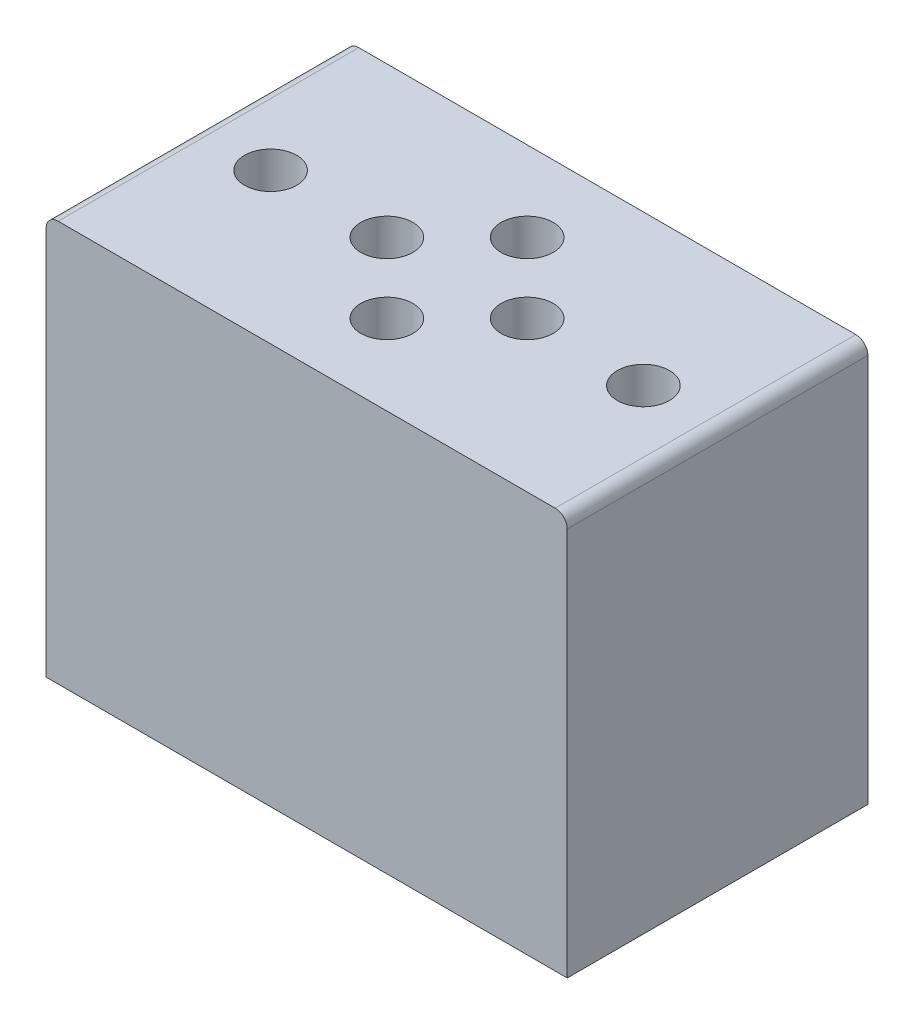
ISO-10303-21;
HEADER;
FILE_DESCRIPTION(('STEP AP214'),'2;1');
FILE_NAME('part.step','',(''),(''),'','','');
FILE_SCHEMA(('AUTOMOTIVE_DESIGN { 1 0 10303 214 1 1 1 1 }'));
ENDSEC;
DATA;
#1=APPLICATION_CONTEXT('core data for automotive mechanical design processes');
#2=APPLICATION_PROTOCOL_DEFINITION('international standard','automotive_design',2000,#1);
#3=PRODUCT_CONTEXT('',#1,'mechanical');
#4=PRODUCT('Part','Part','',(#3));
#5=PRODUCT_RELATED_PRODUCT_CATEGORY('part','',(#4));
#6=PRODUCT_DEFINITION_FORMATION('','',#4);
#7=PRODUCT_DEFINITION_CONTEXT('part definition',#1,'design');
#8=PRODUCT_DEFINITION('design','',#6,#7);
#9=PRODUCT_DEFINITION_SHAPE('','',#8);
#10=(LENGTH_UNIT() NAMED_UNIT(*) SI_UNIT(.MILLI.,.METRE.));
#11=(NAMED_UNIT(*) PLANE_ANGLE_UNIT() SI_UNIT($,.RADIAN.));
#12=(NAMED_UNIT(*) SI_UNIT($,.STERADIAN.) SOLID_ANGLE_UNIT());
#13=UNCERTAINTY_MEASURE_WITH_UNIT(LENGTH_MEASURE(1.E-05),#10,'distance_accuracy_value','');
#14=(GEOMETRIC_REPRESENTATION_CONTEXT(3) GLOBAL_UNCERTAINTY_ASSIGNED_CONTEXT((#13)) GLOBAL_UNIT_ASSIGNED_CONTEXT((#10,
#11,#12)) REPRESENTATION_CONTEXT('',''));
#15=CARTESIAN_POINT('',(0.,0.,0.));
#16=DIRECTION('',(0.,0.,1.));
#17=DIRECTION('',(1.,0.,0.));
#18=AXIS2_PLACEMENT_3D('',#15,#16,#17);
#19=CARTESIAN_POINT('',(17.3031363202317,13.4467980170822,-20.));
#20=DIRECTION('',(1.,0.,0.));
#21=DIRECTION('',(0.,1.,0.));
#22=AXIS2_PLACEMENT_3D('',#19,#20,#21);
#23=PLANE('',#22);
#24=DIRECTION('',(0.,0.,1.));
#25=VECTOR('',#24,1.);
#26=CARTESIAN_POINT('',(17.3031363202317,13.4467980170822,-20.));
#27=LINE('',#26,#25);
#28=CARTESIAN_POINT('',(17.3031363202317,13.4467980170822,-20.));
#29=VERTEX_POINT('',#28);
#30=CARTESIAN_POINT('',(17.3031363202317,13.4467980170822,10.));
#31=VERTEX_POINT('',#30);
#32=EDGE_CURVE('E38',#29,#31,#27,.T.);
#33=ORIENTED_EDGE('',*,*,#32,.T.);
#34=DIRECTION('',(0.,1.,0.));
#35=VECTOR('',#34,1.);
#36=CARTESIAN_POINT('',(17.3031363202317,-25.3532019829178,10.));
#37=LINE('',#36,#35);
#38=CARTESIAN_POINT('',(17.3031363202317,-25.3532019829178,10.));
#39=VERTEX_POINT('',#38);
#40=EDGE_CURVE('E91',#39,#31,#37,.T.);
#41=ORIENTED_EDGE('',*,*,#40,.F.);
#42=DIRECTION('',(0.,0.,1.));
#43=VECTOR('',#42,1.);
#44=CARTESIAN_POINT('',(17.3031363202317,-25.3532019829178,-20.));
#45=LINE('',#44,#43);
#46=CARTESIAN_POINT('',(17.3031363202317,-25.3532019829178,-20.));
#47=VERTEX_POINT('',#46);
#48=EDGE_CURVE('E11',#47,#39,#45,.T.);
#49=ORIENTED_EDGE('',*,*,#48,.F.);
#50=DIRECTION('',(0.,1.,0.));
#51=VECTOR('',#50,1.);
#52=CARTESIAN_POINT('',(17.3031363202317,13.4467980170822,-20.));
#53=LINE('',#52,#51);
#54=EDGE_CURVE('E118',#47,#29,#53,.T.);
#55=ORIENTED_EDGE('',*,*,#54,.T.);
#56=EDGE_LOOP('',(#33,#41,#49,#55));
#57=FACE_BOUND('',#56,.T.);
#58=ADVANCED_FACE('F35',(#57),#23,.T.);
#59=CARTESIAN_POINT('',(-34.6968636797682,-25.3532019829178,-20.));
#60=DIRECTION('',(0.,-1.,0.));
#61=DIRECTION('',(0.,0.,-1.));
#62=AXIS2_PLACEMENT_3D('',#59,#60,#61);
#63=PLANE('',#62);
#64=ORIENTED_EDGE('',*,*,#48,.T.);
#65=DIRECTION('',(1.,0.,0.));
#66=VECTOR('',#65,1.);
#67=CARTESIAN_POINT('',(-34.6968636797682,-25.3532019829178,10.));
#68=LINE('',#67,#66);
#69=CARTESIAN_POINT('',(-34.6968636797682,-25.3532019829178,10.));
#70=VERTEX_POINT('',#69);
#71=EDGE_CURVE('E87',#70,#39,#68,.T.);
#72=ORIENTED_EDGE('',*,*,#71,.F.);
#73=DIRECTION('',(0.,0.,1.));
#74=VECTOR('',#73,1.);
#75=CARTESIAN_POINT('',(-34.6968636797682,-25.3532019829178,-20.));
#76=LINE('',#75,#74);
#77=CARTESIAN_POINT('',(-34.6968636797682,-25.3532019829178,-20.));
#78=VERTEX_POINT('',#77);
#79=EDGE_CURVE('E43',#78,#70,#76,.T.);
#80=ORIENTED_EDGE('',*,*,#79,.F.);
#81=DIRECTION('',(1.,0.,0.));
#82=VECTOR('',#81,1.);
#83=CARTESIAN_POINT('',(-34.6968636797682,-25.3532019829178,-20.));
#84=LINE('',#83,#82);
#85=EDGE_CURVE('E89',#78,#47,#84,.T.);
#86=ORIENTED_EDGE('',*,*,#85,.T.);
#87=EDGE_LOOP('',(#64,#72,#80,#86));
#88=FACE_BOUND('',#87,.T.);
#89=ADVANCED_FACE('F85',(#88),#63,.T.);
#90=CARTESIAN_POINT('',(-34.6968636797683,13.4467980170822,-20.));
#91=DIRECTION('',(-1.,0.,0.));
#92=DIRECTION('',(0.,-1.,0.));
#93=AXIS2_PLACEMENT_3D('',#90,#91,#92);
#94=PLANE('',#93);
#95=ORIENTED_EDGE('',*,*,#79,.T.);
#96=DIRECTION('',(0.,-1.,0.));
#97=VECTOR('',#96,1.);
#98=CARTESIAN_POINT('',(-34.6968636797683,13.4467980170822,10.));
#99=LINE('',#98,#97);
#100=CARTESIAN_POINT('',(-34.6968636797683,13.4467980170822,10.));
#101=VERTEX_POINT('',#100);
#102=EDGE_CURVE('E101',#101,#70,#99,.T.);
#103=ORIENTED_EDGE('',*,*,#102,.F.);
#104=DIRECTION('',(0.,0.,1.));
#105=VECTOR('',#104,1.);
#106=CARTESIAN_POINT('',(-34.6968636797683,13.4467980170822,-20.));
#107=LINE('',#106,#105);
#108=CARTESIAN_POINT('',(-34.6968636797683,13.4467980170822,-20.));
#109=VERTEX_POINT('',#108);
#110=EDGE_CURVE('E133',#109,#101,#107,.T.);
#111=ORIENTED_EDGE('',*,*,#110,.F.);
#112=DIRECTION('',(0.,-1.,0.));
#113=VECTOR('',#112,1.);
#114=CARTESIAN_POINT('',(-34.6968636797683,13.4467980170822,-20.));
#115=LINE('',#114,#113);
#116=EDGE_CURVE('E129',#109,#78,#115,.T.);
#117=ORIENTED_EDGE('',*,*,#116,.T.);
#118=EDGE_LOOP('',(#95,#103,#111,#117));
#119=FACE_BOUND('',#118,.T.);
#120=ADVANCED_FACE('F152',(#119),#94,.T.);
#121=CARTESIAN_POINT('',(-33.4968636797683,13.4467980170822,-20.));
#122=DIRECTION('',(0.,0.,1.));
#123=DIRECTION('',(1.,0.,0.));
#124=AXIS2_PLACEMENT_3D('',#121,#122,#123);
#125=CYLINDRICAL_SURFACE('',#124,1.2);
#126=ORIENTED_EDGE('',*,*,#110,.T.);
#127=CARTESIAN_POINT('',(-33.4968636797683,13.4467980170822,10.));
#128=DIRECTION('',(0.,0.,1.));
#129=DIRECTION('',(1.,0.,0.));
#130=AXIS2_PLACEMENT_3D('',#127,#128,#129);
#131=CIRCLE('',#130,1.2);
#132=CARTESIAN_POINT('',(-33.4968636797683,14.6467980170822,10.));
#133=VERTEX_POINT('',#132);
#134=EDGE_CURVE('E115',#133,#101,#131,.T.);
#135=ORIENTED_EDGE('',*,*,#134,.F.);
#136=DIRECTION('',(0.,0.,1.));
#137=VECTOR('',#136,1.);
#138=CARTESIAN_POINT('',(-33.4968636797683,14.6467980170822,-20.));
#139=LINE('',#138,#137);
#140=CARTESIAN_POINT('',(-33.4968636797683,14.6467980170822,-20.));
#141=VERTEX_POINT('',#140);
#142=EDGE_CURVE('E135',#141,#133,#139,.T.);
#143=ORIENTED_EDGE('',*,*,#142,.F.);
#144=CARTESIAN_POINT('',(-33.4968636797683,13.4467980170822,-20.));
#145=DIRECTION('',(0.,0.,1.));
#146=DIRECTION('',(1.,0.,0.));
#147=AXIS2_PLACEMENT_3D('',#144,#145,#146);
#148=CIRCLE('',#147,1.2);
#149=EDGE_CURVE('E126',#141,#109,#148,.T.);
#150=ORIENTED_EDGE('',*,*,#149,.T.);
#151=EDGE_LOOP('',(#126,#135,#143,#150));
#152=FACE_BOUND('',#151,.T.);
#153=ADVANCED_FACE('F147',(#152),#125,.T.);
#154=CARTESIAN_POINT('',(-33.4968636797683,14.6467980170822,-20.));
#155=DIRECTION('',(0.,1.,0.));
#156=DIRECTION('',(0.,0.,1.));
#157=AXIS2_PLACEMENT_3D('',#154,#155,#156);
#158=PLANE('',#157);
#159=CARTESIAN_POINT('',(-27.296863679768,14.6467980170822,-5.));
#160=DIRECTION('',(0.,1.,0.));
#161=DIRECTION('',(0.,0.,1.));
#162=AXIS2_PLACEMENT_3D('',#159,#160,#161);
#163=CIRCLE('',#162,2.6);
#164=CARTESIAN_POINT('',(-27.296863679768,14.6467980170822,-2.4));
#165=VERTEX_POINT('',#164);
#166=EDGE_CURVE('E105',#165,#165,#163,.T.);
#167=ORIENTED_EDGE('',*,*,#166,.F.);
#168=EDGE_LOOP('',(#167));
#169=FACE_BOUND('',#168,.T.);
#170=CARTESIAN_POINT('',(-1.696863679768,14.6467980170822,-5.));
#171=DIRECTION('',(0.,1.,0.));
#172=DIRECTION('',(0.,0.,1.));
#173=AXIS2_PLACEMENT_3D('',#170,#171,#172);
#174=CIRCLE('',#173,2.6);
#175=CARTESIAN_POINT('',(-1.696863679768,14.6467980170822,-2.4));
#176=VERTEX_POINT('',#175);
#177=EDGE_CURVE('E381',#176,#176,#174,.T.);
#178=ORIENTED_EDGE('',*,*,#177,.F.);
#179=EDGE_LOOP('',(#178));
#180=FACE_BOUND('',#179,.T.);
#181=CARTESIAN_POINT('',(-8.696863679768,14.6467980170822,2.));
#182=DIRECTION('',(0.,1.,0.));
#183=DIRECTION('',(0.,0.,1.));
#184=AXIS2_PLACEMENT_3D('',#181,#182,#183);
#185=CIRCLE('',#184,2.6);
#186=CARTESIAN_POINT('',(-8.696863679768,14.6467980170822,4.6));
#187=VERTEX_POINT('',#186);
#188=EDGE_CURVE('E375',#187,#187,#185,.T.);
#189=ORIENTED_EDGE('',*,*,#188,.F.);
#190=EDGE_LOOP('',(#189));
#191=FACE_BOUND('',#190,.T.);
#192=CARTESIAN_POINT('',(-8.696863679768,14.6467980170822,-12.));
#193=DIRECTION('',(0.,1.,0.));
#194=DIRECTION('',(0.,0.,1.));
#195=AXIS2_PLACEMENT_3D('',#192,#193,#194);
#196=CIRCLE('',#195,2.6);
#197=CARTESIAN_POINT('',(-8.696863679768,14.6467980170822,-9.4));
#198=VERTEX_POINT('',#197);
#199=EDGE_CURVE('E374',#198,#198,#196,.T.);
#200=ORIENTED_EDGE('',*,*,#199,.F.);
#201=EDGE_LOOP('',(#200));
#202=FACE_BOUND('',#201,.T.);
#203=CARTESIAN_POINT('',(-15.696863679768,14.6467980170822,-5.));
#204=DIRECTION('',(0.,1.,0.));
#205=DIRECTION('',(0.,0.,1.));
#206=AXIS2_PLACEMENT_3D('',#203,#204,#205);
#207=CIRCLE('',#206,2.6);
#208=CARTESIAN_POINT('',(-15.696863679768,14.6467980170822,-2.4));
#209=VERTEX_POINT('',#208);
#210=EDGE_CURVE('E387',#209,#209,#207,.T.);
#211=ORIENTED_EDGE('',*,*,#210,.F.);
#212=EDGE_LOOP('',(#211));
#213=FACE_BOUND('',#212,.T.);
#214=CARTESIAN_POINT('',(9.903136320232,14.6467980170822,-5.));
#215=DIRECTION('',(0.,1.,0.));
#216=DIRECTION('',(0.,0.,1.));
#217=AXIS2_PLACEMENT_3D('',#214,#215,#216);
#218=CIRCLE('',#217,2.6);
#219=CARTESIAN_POINT('',(9.903136320232,14.6467980170822,-2.4));
#220=VERTEX_POINT('',#219);
#221=EDGE_CURVE('E108',#220,#220,#218,.T.);
#222=ORIENTED_EDGE('',*,*,#221,.F.);
#223=EDGE_LOOP('',(#222));
#224=FACE_BOUND('',#223,.T.);
#225=ORIENTED_EDGE('',*,*,#142,.T.);
#226=DIRECTION('',(-1.,0.,0.));
#227=VECTOR('',#226,1.);
#228=CARTESIAN_POINT('',(16.1031363202317,14.6467980170822,10.));
#229=LINE('',#228,#227);
#230=CARTESIAN_POINT('',(16.1031363202317,14.6467980170822,10.));
#231=VERTEX_POINT('',#230);
#232=EDGE_CURVE('E112',#231,#133,#229,.T.);
#233=ORIENTED_EDGE('',*,*,#232,.F.);
#234=DIRECTION('',(0.,0.,1.));
#235=VECTOR('',#234,1.);
#236=CARTESIAN_POINT('',(16.1031363202317,14.6467980170822,-20.));
#237=LINE('',#236,#235);
#238=CARTESIAN_POINT('',(16.1031363202317,14.6467980170822,-20.));
#239=VERTEX_POINT('',#238);
#240=EDGE_CURVE('E136',#239,#231,#237,.T.);
#241=ORIENTED_EDGE('',*,*,#240,.F.);
#242=DIRECTION('',(-1.,0.,0.));
#243=VECTOR('',#242,1.);
#244=CARTESIAN_POINT('',(-33.4968636797683,14.6467980170822,-20.));
#245=LINE('',#244,#243);
#246=EDGE_CURVE('E123',#239,#141,#245,.T.);
#247=ORIENTED_EDGE('',*,*,#246,.T.);
#248=EDGE_LOOP('',(#225,#233,#241,#247));
#249=FACE_BOUND('',#248,.T.);
#250=ADVANCED_FACE('F144',(#169,#180,#191,#202,#213,#224,#249),#158,.T.);
#251=CARTESIAN_POINT('',(16.1031363202317,13.4467980170822,-20.));
#252=DIRECTION('',(0.,0.,1.));
#253=DIRECTION('',(1.,0.,0.));
#254=AXIS2_PLACEMENT_3D('',#251,#252,#253);
#255=CYLINDRICAL_SURFACE('',#254,1.2);
#256=ORIENTED_EDGE('',*,*,#240,.T.);
#257=CARTESIAN_POINT('',(16.1031363202317,13.4467980170822,10.));
#258=DIRECTION('',(0.,0.,1.));
#259=DIRECTION('',(1.,0.,0.));
#260=AXIS2_PLACEMENT_3D('',#257,#258,#259);
#261=CIRCLE('',#260,1.2);
#262=EDGE_CURVE('E95',#31,#231,#261,.T.);
#263=ORIENTED_EDGE('',*,*,#262,.F.);
#264=ORIENTED_EDGE('',*,*,#32,.F.);
#265=CARTESIAN_POINT('',(16.1031363202317,13.4467980170822,-20.));
#266=DIRECTION('',(0.,0.,1.));
#267=DIRECTION('',(-1.,0.,0.));
#268=AXIS2_PLACEMENT_3D('',#265,#266,#267);
#269=CIRCLE('',#268,1.2);
#270=EDGE_CURVE('E120',#29,#239,#269,.T.);
#271=ORIENTED_EDGE('',*,*,#270,.T.);
#272=EDGE_LOOP('',(#256,#263,#264,#271));
#273=FACE_BOUND('',#272,.T.);
#274=ADVANCED_FACE('F138',(#273),#255,.T.);
#275=CARTESIAN_POINT('',(-33.4968636797683,13.4467980170822,-20.));
#276=DIRECTION('',(0.,0.,1.));
#277=DIRECTION('',(1.,0.,0.));
#278=AXIS2_PLACEMENT_3D('',#275,#276,#277);
#279=PLANE('',#278);
#280=CARTESIAN_POINT('',(-8.69686367976827,-5.3532019829178,-20.));
#281=DIRECTION('',(0.,0.,1.));
#282=DIRECTION('',(1.,0.,0.));
#283=AXIS2_PLACEMENT_3D('',#280,#281,#282);
#284=CIRCLE('',#283,6.6);
#285=CARTESIAN_POINT('',(-2.09686367976826,-5.3532019829178,-20.));
#286=VERTEX_POINT('',#285);
#287=EDGE_CURVE('E363',#286,#286,#284,.F.);
#288=ORIENTED_EDGE('',*,*,#287,.F.);
#289=EDGE_LOOP('',(#288));
#290=FACE_BOUND('',#289,.T.);
#291=ORIENTED_EDGE('',*,*,#54,.F.);
#292=ORIENTED_EDGE('',*,*,#85,.F.);
#293=ORIENTED_EDGE('',*,*,#116,.F.);
#294=ORIENTED_EDGE('',*,*,#149,.F.);
#295=ORIENTED_EDGE('',*,*,#246,.F.);
#296=ORIENTED_EDGE('',*,*,#270,.F.);
#297=EDGE_LOOP('',(#291,#292,#293,#294,#295,#296));
#298=FACE_BOUND('',#297,.T.);
#299=ADVANCED_FACE('F150',(#290,#298),#279,.F.);
#300=CARTESIAN_POINT('',(16.1031363202317,13.4467980170822,10.));
#301=DIRECTION('',(0.,0.,1.));
#302=DIRECTION('',(1.,0.,0.));
#303=AXIS2_PLACEMENT_3D('',#300,#301,#302);
#304=PLANE('',#303);
#305=ORIENTED_EDGE('',*,*,#71,.T.);
#306=ORIENTED_EDGE('',*,*,#40,.T.);
#307=ORIENTED_EDGE('',*,*,#262,.T.);
#308=ORIENTED_EDGE('',*,*,#232,.T.);
#309=ORIENTED_EDGE('',*,*,#134,.T.);
#310=ORIENTED_EDGE('',*,*,#102,.T.);
#311=EDGE_LOOP('',(#305,#306,#307,#308,#309,#310));
#312=FACE_BOUND('',#311,.T.);
#313=ADVANCED_FACE('F98',(#312),#304,.T.);
#314=CARTESIAN_POINT('',(9.903136320232,8.64679801708221,-5.));
#315=DIRECTION('',(0.,1.,0.));
#316=DIRECTION('',(0.,0.,1.));
#317=AXIS2_PLACEMENT_3D('',#314,#315,#316);
#318=CYLINDRICAL_SURFACE('',#317,2.6);
#319=CARTESIAN_POINT('',(9.903136320232,8.64679801708221,-5.));
#320=DIRECTION('',(0.,1.,0.));
#321=DIRECTION('',(0.,0.,1.));
#322=AXIS2_PLACEMENT_3D('',#319,#320,#321);
#323=CIRCLE('',#322,2.6);
#324=CARTESIAN_POINT('',(9.903136320232,8.64679801708221,-2.4));
#325=VERTEX_POINT('',#324);
#326=EDGE_CURVE('E384',#325,#325,#323,.T.);
#327=ORIENTED_EDGE('',*,*,#326,.F.);
#328=EDGE_LOOP('',(#327));
#329=FACE_BOUND('',#328,.T.);
#330=ORIENTED_EDGE('',*,*,#221,.T.);
#331=EDGE_LOOP('',(#330));
#332=FACE_BOUND('',#331,.T.);
#333=ADVANCED_FACE('F201',(#329,#332),#318,.F.);
#334=CARTESIAN_POINT('',(9.903136320232,8.64679801708221,-5.));
#335=DIRECTION('',(0.,1.,0.));
#336=DIRECTION('',(0.,0.,1.));
#337=AXIS2_PLACEMENT_3D('',#334,#335,#336);
#338=PLANE('',#337);
#339=ORIENTED_EDGE('',*,*,#326,.T.);
#340=EDGE_LOOP('',(#339));
#341=FACE_BOUND('',#340,.T.);
#342=ADVANCED_FACE('F218',(#341),#338,.T.);
#343=CARTESIAN_POINT('',(-15.696863679768,8.64679801708221,-5.));
#344=DIRECTION('',(0.,1.,0.));
#345=DIRECTION('',(0.,0.,1.));
#346=AXIS2_PLACEMENT_3D('',#343,#344,#345);
#347=CYLINDRICAL_SURFACE('',#346,2.6);
#348=CARTESIAN_POINT('',(-15.696863679768,8.64679801708221,-5.));
#349=DIRECTION('',(0.,1.,0.));
#350=DIRECTION('',(0.,0.,1.));
#351=AXIS2_PLACEMENT_3D('',#348,#349,#350);
#352=CIRCLE('',#351,2.6);
#353=CARTESIAN_POINT('',(-15.696863679768,8.64679801708221,-2.4));
#354=VERTEX_POINT('',#353);
#355=EDGE_CURVE('E370',#354,#354,#352,.T.);
#356=ORIENTED_EDGE('',*,*,#355,.F.);
#357=EDGE_LOOP('',(#356));
#358=FACE_BOUND('',#357,.T.);
#359=ORIENTED_EDGE('',*,*,#210,.T.);
#360=EDGE_LOOP('',(#359));
#361=FACE_BOUND('',#360,.T.);
#362=ADVANCED_FACE('F228',(#358,#361),#347,.F.);
#363=CARTESIAN_POINT('',(-15.696863679768,8.64679801708221,-5.));
#364=DIRECTION('',(0.,1.,0.));
#365=DIRECTION('',(0.,0.,1.));
#366=AXIS2_PLACEMENT_3D('',#363,#364,#365);
#367=PLANE('',#366);
#368=ORIENTED_EDGE('',*,*,#355,.T.);
#369=EDGE_LOOP('',(#368));
#370=FACE_BOUND('',#369,.T.);
#371=ADVANCED_FACE('F238',(#370),#367,.T.);
#372=CARTESIAN_POINT('',(-8.696863679768,8.64679801708221,-12.));
#373=DIRECTION('',(0.,1.,0.));
#374=DIRECTION('',(0.,0.,1.));
#375=AXIS2_PLACEMENT_3D('',#372,#373,#374);
#376=CYLINDRICAL_SURFACE('',#375,2.6);
#377=CARTESIAN_POINT('',(-8.696863679768,8.64679801708221,-12.));
#378=DIRECTION('',(0.,1.,0.));
#379=DIRECTION('',(0.,0.,1.));
#380=AXIS2_PLACEMENT_3D('',#377,#378,#379);
#381=CIRCLE('',#380,2.6);
#382=CARTESIAN_POINT('',(-8.696863679768,8.64679801708221,-9.4));
#383=VERTEX_POINT('',#382);
#384=EDGE_CURVE('E390',#383,#383,#381,.T.);
#385=ORIENTED_EDGE('',*,*,#384,.F.);
#386=EDGE_LOOP('',(#385));
#387=FACE_BOUND('',#386,.T.);
#388=ORIENTED_EDGE('',*,*,#199,.T.);
#389=EDGE_LOOP('',(#388));
#390=FACE_BOUND('',#389,.T.);
#391=ADVANCED_FACE('F248',(#387,#390),#376,.F.);
#392=CARTESIAN_POINT('',(-8.696863679768,8.64679801708221,-12.));
#393=DIRECTION('',(0.,1.,0.));
#394=DIRECTION('',(0.,0.,1.));
#395=AXIS2_PLACEMENT_3D('',#392,#393,#394);
#396=PLANE('',#395);
#397=ORIENTED_EDGE('',*,*,#384,.T.);
#398=EDGE_LOOP('',(#397));
#399=FACE_BOUND('',#398,.T.);
#400=ADVANCED_FACE('F258',(#399),#396,.T.);
#401=CARTESIAN_POINT('',(-8.696863679768,8.64679801708221,2.));
#402=DIRECTION('',(0.,1.,0.));
#403=DIRECTION('',(0.,0.,1.));
#404=AXIS2_PLACEMENT_3D('',#401,#402,#403);
#405=CYLINDRICAL_SURFACE('',#404,2.6);
#406=CARTESIAN_POINT('',(-8.696863679768,8.64679801708221,2.));
#407=DIRECTION('',(0.,1.,0.));
#408=DIRECTION('',(0.,0.,1.));
#409=AXIS2_PLACEMENT_3D('',#406,#407,#408);
#410=CIRCLE('',#409,2.6);
#411=CARTESIAN_POINT('',(-8.696863679768,8.64679801708221,4.6));
#412=VERTEX_POINT('',#411);
#413=EDGE_CURVE('E371',#412,#412,#410,.T.);
#414=ORIENTED_EDGE('',*,*,#413,.F.);
#415=EDGE_LOOP('',(#414));
#416=FACE_BOUND('',#415,.T.);
#417=ORIENTED_EDGE('',*,*,#188,.T.);
#418=EDGE_LOOP('',(#417));
#419=FACE_BOUND('',#418,.T.);
#420=ADVANCED_FACE('F268',(#416,#419),#405,.F.);
#421=CARTESIAN_POINT('',(-8.696863679768,8.64679801708221,2.));
#422=DIRECTION('',(0.,1.,0.));
#423=DIRECTION('',(0.,0.,1.));
#424=AXIS2_PLACEMENT_3D('',#421,#422,#423);
#425=PLANE('',#424);
#426=ORIENTED_EDGE('',*,*,#413,.T.);
#427=EDGE_LOOP('',(#426));
#428=FACE_BOUND('',#427,.T.);
#429=ADVANCED_FACE('F278',(#428),#425,.T.);
#430=CARTESIAN_POINT('',(-1.696863679768,8.64679801708221,-5.));
#431=DIRECTION('',(0.,1.,0.));
#432=DIRECTION('',(0.,0.,1.));
#433=AXIS2_PLACEMENT_3D('',#430,#431,#432);
#434=CYLINDRICAL_SURFACE('',#433,2.6);
#435=CARTESIAN_POINT('',(-1.696863679768,8.64679801708221,-5.));
#436=DIRECTION('',(0.,1.,0.));
#437=DIRECTION('',(0.,0.,1.));
#438=AXIS2_PLACEMENT_3D('',#435,#436,#437);
#439=CIRCLE('',#438,2.6);
#440=CARTESIAN_POINT('',(-1.696863679768,8.64679801708221,-2.4));
#441=VERTEX_POINT('',#440);
#442=EDGE_CURVE('E378',#441,#441,#439,.T.);
#443=ORIENTED_EDGE('',*,*,#442,.F.);
#444=EDGE_LOOP('',(#443));
#445=FACE_BOUND('',#444,.T.);
#446=ORIENTED_EDGE('',*,*,#177,.T.);
#447=EDGE_LOOP('',(#446));
#448=FACE_BOUND('',#447,.T.);
#449=ADVANCED_FACE('F288',(#445,#448),#434,.F.);
#450=CARTESIAN_POINT('',(-1.696863679768,8.64679801708221,-5.));
#451=DIRECTION('',(0.,1.,0.));
#452=DIRECTION('',(0.,0.,1.));
#453=AXIS2_PLACEMENT_3D('',#450,#451,#452);
#454=PLANE('',#453);
#455=ORIENTED_EDGE('',*,*,#442,.T.);
#456=EDGE_LOOP('',(#455));
#457=FACE_BOUND('',#456,.T.);
#458=ADVANCED_FACE('F298',(#457),#454,.T.);
#459=CARTESIAN_POINT('',(-27.296863679768,8.64679801708221,-5.));
#460=DIRECTION('',(0.,1.,0.));
#461=DIRECTION('',(0.,0.,1.));
#462=AXIS2_PLACEMENT_3D('',#459,#460,#461);
#463=CYLINDRICAL_SURFACE('',#462,2.6);
#464=CARTESIAN_POINT('',(-27.296863679768,8.64679801708221,-5.));
#465=DIRECTION('',(0.,1.,0.));
#466=DIRECTION('',(0.,0.,1.));
#467=AXIS2_PLACEMENT_3D('',#464,#465,#466);
#468=CIRCLE('',#467,2.6);
#469=CARTESIAN_POINT('',(-27.296863679768,8.64679801708221,-2.4));
#470=VERTEX_POINT('',#469);
#471=EDGE_CURVE('E102',#470,#470,#468,.T.);
#472=ORIENTED_EDGE('',*,*,#471,.F.);
#473=EDGE_LOOP('',(#472));
#474=FACE_BOUND('',#473,.T.);
#475=ORIENTED_EDGE('',*,*,#166,.T.);
#476=EDGE_LOOP('',(#475));
#477=FACE_BOUND('',#476,.T.);
#478=ADVANCED_FACE('F308',(#474,#477),#463,.F.);
#479=CARTESIAN_POINT('',(-27.296863679768,8.64679801708221,-5.));
#480=DIRECTION('',(0.,1.,0.));
#481=DIRECTION('',(0.,0.,1.));
#482=AXIS2_PLACEMENT_3D('',#479,#480,#481);
#483=PLANE('',#482);
#484=ORIENTED_EDGE('',*,*,#471,.T.);
#485=EDGE_LOOP('',(#484));
#486=FACE_BOUND('',#485,.T.);
#487=ADVANCED_FACE('F318',(#486),#483,.T.);
#488=CARTESIAN_POINT('',(-8.69686367976827,-5.3532019829178,-20.001));
#489=DIRECTION('',(0.,0.,1.));
#490=DIRECTION('',(1.,0.,0.));
#491=AXIS2_PLACEMENT_3D('',#488,#489,#490);
#492=CYLINDRICAL_SURFACE('',#491,6.6);
#493=CARTESIAN_POINT('',(-8.69686367976827,-5.3532019829178,0.));
#494=DIRECTION('',(0.,0.,1.));
#495=DIRECTION('',(1.,0.,0.));
#496=AXIS2_PLACEMENT_3D('',#493,#494,#495);
#497=CIRCLE('',#496,6.6);
#498=CARTESIAN_POINT('',(-2.09686367976826,-5.3532019829178,0.));
#499=VERTEX_POINT('',#498);
#500=EDGE_CURVE('E362',#499,#499,#497,.T.);
#501=ORIENTED_EDGE('',*,*,#500,.T.);
#502=EDGE_LOOP('',(#501));
#503=FACE_BOUND('',#502,.T.);
#504=ORIENTED_EDGE('',*,*,#287,.T.);
#505=EDGE_LOOP('',(#504));
#506=FACE_BOUND('',#505,.T.);
#507=ADVANCED_FACE('F328',(#503,#506),#492,.F.);
#508=CARTESIAN_POINT('',(-8.69686367976827,-5.3532019829178,0.));
#509=DIRECTION('',(0.,0.,1.));
#510=DIRECTION('',(1.,0.,0.));
#511=AXIS2_PLACEMENT_3D('',#508,#509,#510);
#512=PLANE('',#511);
#513=ORIENTED_EDGE('',*,*,#500,.F.);
#514=EDGE_LOOP('',(#513));
#515=FACE_BOUND('',#514,.T.);
#516=ADVANCED_FACE('F346',(#515),#512,.F.);
#517=CLOSED_SHELL('',(#58,#89,#120,#153,#250,#274,#299,#313,#333,#342,#362,#371,#391,#400,#420,
#429,#449,#458,#478,#487,#507,#516));
#518=MANIFOLD_SOLID_BREP('B2',#517);
#519=ADVANCED_BREP_SHAPE_REPRESENTATION('',(#18,#518),#14);
#520=SHAPE_DEFINITION_REPRESENTATION(#9,#519);
ENDSEC;
END-ISO-10303-21;
